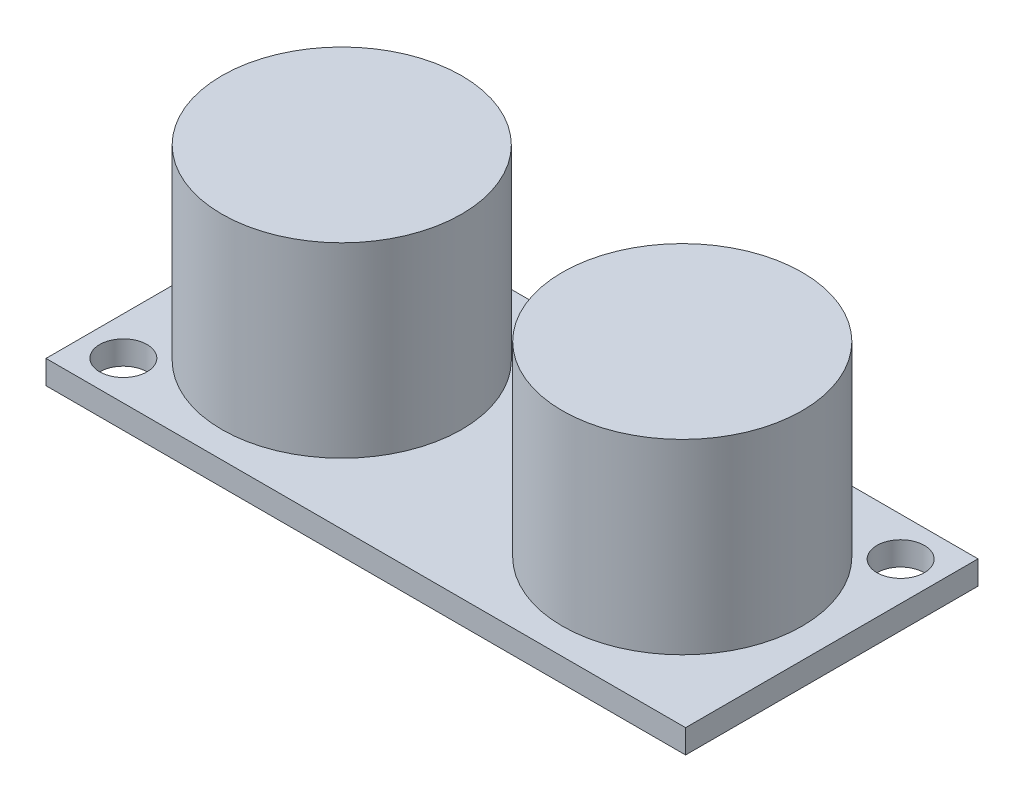
ISO-10303-21;
HEADER;
FILE_DESCRIPTION(('STEP AP214'),'2;1');
FILE_NAME('part.step','',(''),(''),'','','');
FILE_SCHEMA(('AUTOMOTIVE_DESIGN { 1 0 10303 214 1 1 1 1 }'));
ENDSEC;
DATA;
#1=APPLICATION_CONTEXT('core data for automotive mechanical design processes');
#2=APPLICATION_PROTOCOL_DEFINITION('international standard','automotive_design',2000,#1);
#3=PRODUCT_CONTEXT('',#1,'mechanical');
#4=PRODUCT('Part','Part','',(#3));
#5=PRODUCT_RELATED_PRODUCT_CATEGORY('part','',(#4));
#6=PRODUCT_DEFINITION_FORMATION('','',#4);
#7=PRODUCT_DEFINITION_CONTEXT('part definition',#1,'design');
#8=PRODUCT_DEFINITION('design','',#6,#7);
#9=PRODUCT_DEFINITION_SHAPE('','',#8);
#10=(LENGTH_UNIT() NAMED_UNIT(*) SI_UNIT(.MILLI.,.METRE.));
#11=(NAMED_UNIT(*) PLANE_ANGLE_UNIT() SI_UNIT($,.RADIAN.));
#12=(NAMED_UNIT(*) SI_UNIT($,.STERADIAN.) SOLID_ANGLE_UNIT());
#13=UNCERTAINTY_MEASURE_WITH_UNIT(LENGTH_MEASURE(1.E-05),#10,'distance_accuracy_value','');
#14=(GEOMETRIC_REPRESENTATION_CONTEXT(3) GLOBAL_UNCERTAINTY_ASSIGNED_CONTEXT((#13)) GLOBAL_UNIT_ASSIGNED_CONTEXT((#10,
#11,#12)) REPRESENTATION_CONTEXT('',''));
#15=CARTESIAN_POINT('',(0.,0.,0.));
#16=DIRECTION('',(0.,0.,1.));
#17=DIRECTION('',(1.,0.,0.));
#18=AXIS2_PLACEMENT_3D('',#15,#16,#17);
#19=CARTESIAN_POINT('',(0.,14.2,0.));
#20=DIRECTION('',(0.,1.,0.));
#21=DIRECTION('',(0.,0.,1.));
#22=AXIS2_PLACEMENT_3D('',#19,#20,#21);
#23=PLANE('',#22);
#24=CARTESIAN_POINT('',(-11.5,14.2,0.));
#25=DIRECTION('',(0.,1.,0.));
#26=DIRECTION('',(0.,0.,1.));
#27=AXIS2_PLACEMENT_3D('',#24,#25,#26);
#28=CIRCLE('',#27,8.1);
#29=CARTESIAN_POINT('',(-11.5,14.2,8.1));
#30=VERTEX_POINT('',#29);
#31=EDGE_CURVE('E19',#30,#30,#28,.F.);
#32=ORIENTED_EDGE('',*,*,#31,.F.);
#33=EDGE_LOOP('',(#32));
#34=FACE_BOUND('',#33,.T.);
#35=ADVANCED_FACE('F16',(#34),#23,.T.);
#36=CARTESIAN_POINT('',(0.,14.2,0.));
#37=DIRECTION('',(0.,1.,0.));
#38=DIRECTION('',(0.,0.,1.));
#39=AXIS2_PLACEMENT_3D('',#36,#37,#38);
#40=PLANE('',#39);
#41=CARTESIAN_POINT('',(11.5,14.2,0.));
#42=DIRECTION('',(0.,1.,0.));
#43=DIRECTION('',(0.,0.,1.));
#44=AXIS2_PLACEMENT_3D('',#41,#42,#43);
#45=CIRCLE('',#44,8.1);
#46=CARTESIAN_POINT('',(11.5,14.2,8.1));
#47=VERTEX_POINT('',#46);
#48=EDGE_CURVE('E152',#47,#47,#45,.F.);
#49=ORIENTED_EDGE('',*,*,#48,.F.);
#50=EDGE_LOOP('',(#49));
#51=FACE_BOUND('',#50,.T.);
#52=ADVANCED_FACE('F163',(#51),#40,.T.);
#53=CARTESIAN_POINT('',(-11.5,1.6,0.));
#54=DIRECTION('',(0.,1.,0.));
#55=DIRECTION('',(0.,0.,1.));
#56=AXIS2_PLACEMENT_3D('',#53,#54,#55);
#57=CYLINDRICAL_SURFACE('',#56,8.1);
#58=ORIENTED_EDGE('',*,*,#31,.T.);
#59=EDGE_LOOP('',(#58));
#60=FACE_BOUND('',#59,.T.);
#61=CARTESIAN_POINT('',(-11.5,1.6,0.));
#62=DIRECTION('',(0.,1.,0.));
#63=DIRECTION('',(0.,0.,1.));
#64=AXIS2_PLACEMENT_3D('',#61,#62,#63);
#65=CIRCLE('',#64,8.1);
#66=CARTESIAN_POINT('',(-11.5,1.6,8.1));
#67=VERTEX_POINT('',#66);
#68=EDGE_CURVE('E150',#67,#67,#65,.F.);
#69=ORIENTED_EDGE('',*,*,#68,.F.);
#70=EDGE_LOOP('',(#69));
#71=FACE_BOUND('',#70,.T.);
#72=ADVANCED_FACE('F159',(#60,#71),#57,.T.);
#73=CARTESIAN_POINT('',(11.5,1.6,0.));
#74=DIRECTION('',(0.,1.,0.));
#75=DIRECTION('',(0.,0.,1.));
#76=AXIS2_PLACEMENT_3D('',#73,#74,#75);
#77=CYLINDRICAL_SURFACE('',#76,8.1);
#78=ORIENTED_EDGE('',*,*,#48,.T.);
#79=EDGE_LOOP('',(#78));
#80=FACE_BOUND('',#79,.T.);
#81=CARTESIAN_POINT('',(11.5,1.6,0.));
#82=DIRECTION('',(0.,1.,0.));
#83=DIRECTION('',(0.,0.,1.));
#84=AXIS2_PLACEMENT_3D('',#81,#82,#83);
#85=CIRCLE('',#84,8.1);
#86=CARTESIAN_POINT('',(11.5,1.6,8.1));
#87=VERTEX_POINT('',#86);
#88=EDGE_CURVE('E147',#87,#87,#85,.F.);
#89=ORIENTED_EDGE('',*,*,#88,.F.);
#90=EDGE_LOOP('',(#89));
#91=FACE_BOUND('',#90,.T.);
#92=ADVANCED_FACE('F239',(#80,#91),#77,.T.);
#93=CARTESIAN_POINT('',(0.,-2.1,0.));
#94=DIRECTION('',(0.,-1.,0.));
#95=DIRECTION('',(0.,0.,-1.));
#96=AXIS2_PLACEMENT_3D('',#93,#94,#95);
#97=PLANE('',#96);
#98=DIRECTION('',(-1.,0.,0.));
#99=VECTOR('',#98,1.);
#100=CARTESIAN_POINT('',(-2.907056089516,-2.1,-2.35129536652));
#101=LINE('',#100,#99);
#102=CARTESIAN_POINT('',(3.078059388899,-2.1,-2.35129536652));
#103=VERTEX_POINT('',#102);
#104=CARTESIAN_POINT('',(-2.907056089516,-2.1,-2.35129536652));
#105=VERTEX_POINT('',#104);
#106=EDGE_CURVE('E399',#103,#105,#101,.T.);
#107=ORIENTED_EDGE('',*,*,#106,.F.);
#108=DIRECTION('',(0.,0.,-1.));
#109=VECTOR('',#108,1.);
#110=CARTESIAN_POINT('',(3.078059388899,-2.1,-2.35129536652));
#111=LINE('',#110,#109);
#112=CARTESIAN_POINT('',(3.078059388899,-2.1,1.752783818679));
#113=VERTEX_POINT('',#112);
#114=EDGE_CURVE('E84',#113,#103,#111,.T.);
#115=ORIENTED_EDGE('',*,*,#114,.F.);
#116=DIRECTION('',(1.,0.,0.));
#117=VECTOR('',#116,1.);
#118=CARTESIAN_POINT('',(3.078059388899,-2.1,1.752783818679));
#119=LINE('',#118,#117);
#120=CARTESIAN_POINT('',(-2.907056089516,-2.1,1.752783818679));
#121=VERTEX_POINT('',#120);
#122=EDGE_CURVE('E81',#121,#113,#119,.T.);
#123=ORIENTED_EDGE('',*,*,#122,.F.);
#124=DIRECTION('',(0.,0.,1.));
#125=VECTOR('',#124,1.);
#126=CARTESIAN_POINT('',(-2.907056089516,-2.1,1.752783818679));
#127=LINE('',#126,#125);
#128=EDGE_CURVE('E78',#105,#121,#127,.T.);
#129=ORIENTED_EDGE('',*,*,#128,.F.);
#130=EDGE_LOOP('',(#107,#115,#123,#129));
#131=FACE_BOUND('',#130,.T.);
#132=ADVANCED_FACE('F82',(#131),#97,.T.);
#133=CARTESIAN_POINT('',(0.,1.6,0.));
#134=DIRECTION('',(0.,1.,0.));
#135=DIRECTION('',(0.,0.,1.));
#136=AXIS2_PLACEMENT_3D('',#133,#134,#135);
#137=PLANE('',#136);
#138=DIRECTION('',(1.,0.,0.));
#139=VECTOR('',#138,1.);
#140=CARTESIAN_POINT('',(-21.6,1.6,9.875));
#141=LINE('',#140,#139);
#142=CARTESIAN_POINT('',(21.6,1.6,9.875));
#143=VERTEX_POINT('',#142);
#144=CARTESIAN_POINT('',(-21.6,1.6,9.875));
#145=VERTEX_POINT('',#144);
#146=EDGE_CURVE('E374',#143,#145,#141,.F.);
#147=ORIENTED_EDGE('',*,*,#146,.F.);
#148=DIRECTION('',(0.,0.,-1.));
#149=VECTOR('',#148,1.);
#150=CARTESIAN_POINT('',(21.6,1.6,9.875));
#151=LINE('',#150,#149);
#152=CARTESIAN_POINT('',(21.6,1.6,-9.875));
#153=VERTEX_POINT('',#152);
#154=EDGE_CURVE('E126',#153,#143,#151,.F.);
#155=ORIENTED_EDGE('',*,*,#154,.F.);
#156=DIRECTION('',(-1.,0.,0.));
#157=VECTOR('',#156,1.);
#158=CARTESIAN_POINT('',(21.6,1.6,-9.875));
#159=LINE('',#158,#157);
#160=CARTESIAN_POINT('',(-21.6,1.6,-9.875));
#161=VERTEX_POINT('',#160);
#162=EDGE_CURVE('E392',#161,#153,#159,.F.);
#163=ORIENTED_EDGE('',*,*,#162,.F.);
#164=DIRECTION('',(0.,0.,1.));
#165=VECTOR('',#164,1.);
#166=CARTESIAN_POINT('',(-21.6,1.6,-9.875));
#167=LINE('',#166,#165);
#168=EDGE_CURVE('E376',#145,#161,#167,.F.);
#169=ORIENTED_EDGE('',*,*,#168,.F.);
#170=EDGE_LOOP('',(#147,#155,#163,#169));
#171=FACE_BOUND('',#170,.T.);
#172=ORIENTED_EDGE('',*,*,#88,.T.);
#173=EDGE_LOOP('',(#172));
#174=FACE_BOUND('',#173,.T.);
#175=ORIENTED_EDGE('',*,*,#68,.T.);
#176=EDGE_LOOP('',(#175));
#177=FACE_BOUND('',#176,.T.);
#178=CARTESIAN_POINT('',(0.,1.6,-8.625));
#179=DIRECTION('',(0.,1.,0.));
#180=DIRECTION('',(0.,0.,1.));
#181=AXIS2_PLACEMENT_3D('',#178,#179,#180);
#182=CIRCLE('',#181,0.5);
#183=CARTESIAN_POINT('',(0.,1.6,-8.125));
#184=VERTEX_POINT('',#183);
#185=EDGE_CURVE('E90',#184,#184,#182,.F.);
#186=ORIENTED_EDGE('',*,*,#185,.T.);
#187=EDGE_LOOP('',(#186));
#188=FACE_BOUND('',#187,.T.);
#189=CARTESIAN_POINT('',(2.5,1.6,-8.625));
#190=DIRECTION('',(0.,1.,0.));
#191=DIRECTION('',(0.,0.,1.));
#192=AXIS2_PLACEMENT_3D('',#189,#190,#191);
#193=CIRCLE('',#192,0.5);
#194=CARTESIAN_POINT('',(2.5,1.6,-8.125));
#195=VERTEX_POINT('',#194);
#196=EDGE_CURVE('E129',#195,#195,#193,.F.);
#197=ORIENTED_EDGE('',*,*,#196,.T.);
#198=EDGE_LOOP('',(#197));
#199=FACE_BOUND('',#198,.T.);
#200=CARTESIAN_POINT('',(-2.5,1.6,-8.625));
#201=DIRECTION('',(0.,1.,0.));
#202=DIRECTION('',(0.,0.,1.));
#203=AXIS2_PLACEMENT_3D('',#200,#201,#202);
#204=CIRCLE('',#203,0.5);
#205=CARTESIAN_POINT('',(-2.5,1.6,-8.125));
#206=VERTEX_POINT('',#205);
#207=EDGE_CURVE('E132',#206,#206,#204,.F.);
#208=ORIENTED_EDGE('',*,*,#207,.T.);
#209=EDGE_LOOP('',(#208));
#210=FACE_BOUND('',#209,.T.);
#211=CARTESIAN_POINT('',(5.,1.6,-8.625));
#212=DIRECTION('',(0.,1.,0.));
#213=DIRECTION('',(0.,0.,1.));
#214=AXIS2_PLACEMENT_3D('',#211,#212,#213);
#215=CIRCLE('',#214,0.5);
#216=CARTESIAN_POINT('',(5.,1.6,-8.125));
#217=VERTEX_POINT('',#216);
#218=EDGE_CURVE('E135',#217,#217,#215,.F.);
#219=ORIENTED_EDGE('',*,*,#218,.T.);
#220=EDGE_LOOP('',(#219));
#221=FACE_BOUND('',#220,.T.);
#222=CARTESIAN_POINT('',(-5.,1.6,-8.625));
#223=DIRECTION('',(0.,1.,0.));
#224=DIRECTION('',(0.,0.,1.));
#225=AXIS2_PLACEMENT_3D('',#222,#223,#224);
#226=CIRCLE('',#225,0.5);
#227=CARTESIAN_POINT('',(-5.,1.6,-8.125));
#228=VERTEX_POINT('',#227);
#229=EDGE_CURVE('E138',#228,#228,#226,.F.);
#230=ORIENTED_EDGE('',*,*,#229,.T.);
#231=EDGE_LOOP('',(#230));
#232=FACE_BOUND('',#231,.T.);
#233=CARTESIAN_POINT('',(19.,1.6,-7.25));
#234=DIRECTION('',(0.,1.,0.));
#235=DIRECTION('',(0.,0.,1.));
#236=AXIS2_PLACEMENT_3D('',#233,#234,#235);
#237=CIRCLE('',#236,1.6);
#238=CARTESIAN_POINT('',(19.,1.6,-5.65));
#239=VERTEX_POINT('',#238);
#240=EDGE_CURVE('E141',#239,#239,#237,.F.);
#241=ORIENTED_EDGE('',*,*,#240,.T.);
#242=EDGE_LOOP('',(#241));
#243=FACE_BOUND('',#242,.T.);
#244=CARTESIAN_POINT('',(-19.,1.6,7.25));
#245=DIRECTION('',(0.,1.,0.));
#246=DIRECTION('',(0.,0.,1.));
#247=AXIS2_PLACEMENT_3D('',#244,#245,#246);
#248=CIRCLE('',#247,1.6);
#249=CARTESIAN_POINT('',(-19.,1.6,8.85));
#250=VERTEX_POINT('',#249);
#251=EDGE_CURVE('E144',#250,#250,#248,.F.);
#252=ORIENTED_EDGE('',*,*,#251,.T.);
#253=EDGE_LOOP('',(#252));
#254=FACE_BOUND('',#253,.T.);
#255=ADVANCED_FACE('F232',(#171,#174,#177,#188,#199,#210,#221,#232,#243,#254),#137,.T.);
#256=CARTESIAN_POINT('',(-19.,1.6,7.25));
#257=DIRECTION('',(0.,1.,0.));
#258=DIRECTION('',(0.,0.,1.));
#259=AXIS2_PLACEMENT_3D('',#256,#257,#258);
#260=CYLINDRICAL_SURFACE('',#259,1.6);
#261=ORIENTED_EDGE('',*,*,#251,.F.);
#262=EDGE_LOOP('',(#261));
#263=FACE_BOUND('',#262,.T.);
#264=CARTESIAN_POINT('',(-19.,0.,7.25));
#265=DIRECTION('',(0.,1.,0.));
#266=DIRECTION('',(0.,0.,1.));
#267=AXIS2_PLACEMENT_3D('',#264,#265,#266);
#268=CIRCLE('',#267,1.6);
#269=CARTESIAN_POINT('',(-19.,0.,8.85));
#270=VERTEX_POINT('',#269);
#271=EDGE_CURVE('E123',#270,#270,#268,.F.);
#272=ORIENTED_EDGE('',*,*,#271,.T.);
#273=EDGE_LOOP('',(#272));
#274=FACE_BOUND('',#273,.T.);
#275=ADVANCED_FACE('F228',(#263,#274),#260,.F.);
#276=CARTESIAN_POINT('',(19.,1.6,-7.25));
#277=DIRECTION('',(0.,1.,0.));
#278=DIRECTION('',(0.,0.,1.));
#279=AXIS2_PLACEMENT_3D('',#276,#277,#278);
#280=CYLINDRICAL_SURFACE('',#279,1.6);
#281=ORIENTED_EDGE('',*,*,#240,.F.);
#282=EDGE_LOOP('',(#281));
#283=FACE_BOUND('',#282,.T.);
#284=CARTESIAN_POINT('',(19.,0.,-7.25));
#285=DIRECTION('',(0.,1.,0.));
#286=DIRECTION('',(0.,0.,1.));
#287=AXIS2_PLACEMENT_3D('',#284,#285,#286);
#288=CIRCLE('',#287,1.6);
#289=CARTESIAN_POINT('',(19.,0.,-5.65));
#290=VERTEX_POINT('',#289);
#291=EDGE_CURVE('E120',#290,#290,#288,.F.);
#292=ORIENTED_EDGE('',*,*,#291,.T.);
#293=EDGE_LOOP('',(#292));
#294=FACE_BOUND('',#293,.T.);
#295=ADVANCED_FACE('F224',(#283,#294),#280,.F.);
#296=CARTESIAN_POINT('',(-5.,1.6,-8.625));
#297=DIRECTION('',(0.,1.,0.));
#298=DIRECTION('',(0.,0.,1.));
#299=AXIS2_PLACEMENT_3D('',#296,#297,#298);
#300=CYLINDRICAL_SURFACE('',#299,0.5);
#301=ORIENTED_EDGE('',*,*,#229,.F.);
#302=EDGE_LOOP('',(#301));
#303=FACE_BOUND('',#302,.T.);
#304=CARTESIAN_POINT('',(-5.,0.,-8.625));
#305=DIRECTION('',(0.,1.,0.));
#306=DIRECTION('',(0.,0.,1.));
#307=AXIS2_PLACEMENT_3D('',#304,#305,#306);
#308=CIRCLE('',#307,0.5);
#309=CARTESIAN_POINT('',(-5.,0.,-8.125));
#310=VERTEX_POINT('',#309);
#311=EDGE_CURVE('E117',#310,#310,#308,.F.);
#312=ORIENTED_EDGE('',*,*,#311,.T.);
#313=EDGE_LOOP('',(#312));
#314=FACE_BOUND('',#313,.T.);
#315=ADVANCED_FACE('F220',(#303,#314),#300,.F.);
#316=CARTESIAN_POINT('',(5.,1.6,-8.625));
#317=DIRECTION('',(0.,1.,0.));
#318=DIRECTION('',(0.,0.,1.));
#319=AXIS2_PLACEMENT_3D('',#316,#317,#318);
#320=CYLINDRICAL_SURFACE('',#319,0.5);
#321=ORIENTED_EDGE('',*,*,#218,.F.);
#322=EDGE_LOOP('',(#321));
#323=FACE_BOUND('',#322,.T.);
#324=CARTESIAN_POINT('',(5.,0.,-8.625));
#325=DIRECTION('',(0.,1.,0.));
#326=DIRECTION('',(0.,0.,1.));
#327=AXIS2_PLACEMENT_3D('',#324,#325,#326);
#328=CIRCLE('',#327,0.5);
#329=CARTESIAN_POINT('',(5.,0.,-8.125));
#330=VERTEX_POINT('',#329);
#331=EDGE_CURVE('E114',#330,#330,#328,.F.);
#332=ORIENTED_EDGE('',*,*,#331,.T.);
#333=EDGE_LOOP('',(#332));
#334=FACE_BOUND('',#333,.T.);
#335=ADVANCED_FACE('F216',(#323,#334),#320,.F.);
#336=CARTESIAN_POINT('',(-2.5,1.6,-8.625));
#337=DIRECTION('',(0.,1.,0.));
#338=DIRECTION('',(0.,0.,1.));
#339=AXIS2_PLACEMENT_3D('',#336,#337,#338);
#340=CYLINDRICAL_SURFACE('',#339,0.5);
#341=ORIENTED_EDGE('',*,*,#207,.F.);
#342=EDGE_LOOP('',(#341));
#343=FACE_BOUND('',#342,.T.);
#344=CARTESIAN_POINT('',(-2.5,0.,-8.625));
#345=DIRECTION('',(0.,1.,0.));
#346=DIRECTION('',(0.,0.,1.));
#347=AXIS2_PLACEMENT_3D('',#344,#345,#346);
#348=CIRCLE('',#347,0.5);
#349=CARTESIAN_POINT('',(-2.5,0.,-8.125));
#350=VERTEX_POINT('',#349);
#351=EDGE_CURVE('E111',#350,#350,#348,.F.);
#352=ORIENTED_EDGE('',*,*,#351,.T.);
#353=EDGE_LOOP('',(#352));
#354=FACE_BOUND('',#353,.T.);
#355=ADVANCED_FACE('F212',(#343,#354),#340,.F.);
#356=CARTESIAN_POINT('',(2.5,1.6,-8.625));
#357=DIRECTION('',(0.,1.,0.));
#358=DIRECTION('',(0.,0.,1.));
#359=AXIS2_PLACEMENT_3D('',#356,#357,#358);
#360=CYLINDRICAL_SURFACE('',#359,0.5);
#361=ORIENTED_EDGE('',*,*,#196,.F.);
#362=EDGE_LOOP('',(#361));
#363=FACE_BOUND('',#362,.T.);
#364=CARTESIAN_POINT('',(2.5,0.,-8.625));
#365=DIRECTION('',(0.,1.,0.));
#366=DIRECTION('',(0.,0.,1.));
#367=AXIS2_PLACEMENT_3D('',#364,#365,#366);
#368=CIRCLE('',#367,0.5);
#369=CARTESIAN_POINT('',(2.5,0.,-8.125));
#370=VERTEX_POINT('',#369);
#371=EDGE_CURVE('E108',#370,#370,#368,.F.);
#372=ORIENTED_EDGE('',*,*,#371,.T.);
#373=EDGE_LOOP('',(#372));
#374=FACE_BOUND('',#373,.T.);
#375=ADVANCED_FACE('F208',(#363,#374),#360,.F.);
#376=CARTESIAN_POINT('',(0.,1.6,-8.625));
#377=DIRECTION('',(0.,1.,0.));
#378=DIRECTION('',(0.,0.,1.));
#379=AXIS2_PLACEMENT_3D('',#376,#377,#378);
#380=CYLINDRICAL_SURFACE('',#379,0.5);
#381=ORIENTED_EDGE('',*,*,#185,.F.);
#382=EDGE_LOOP('',(#381));
#383=FACE_BOUND('',#382,.T.);
#384=CARTESIAN_POINT('',(0.,0.,-8.625));
#385=DIRECTION('',(0.,1.,0.));
#386=DIRECTION('',(0.,0.,1.));
#387=AXIS2_PLACEMENT_3D('',#384,#385,#386);
#388=CIRCLE('',#387,0.5);
#389=CARTESIAN_POINT('',(0.,0.,-8.125));
#390=VERTEX_POINT('',#389);
#391=EDGE_CURVE('E105',#390,#390,#388,.F.);
#392=ORIENTED_EDGE('',*,*,#391,.T.);
#393=EDGE_LOOP('',(#392));
#394=FACE_BOUND('',#393,.T.);
#395=ADVANCED_FACE('F205',(#383,#394),#380,.F.);
#396=CARTESIAN_POINT('',(3.078059388899,0.,1.752783818679));
#397=DIRECTION('',(0.,0.,1.));
#398=DIRECTION('',(1.,0.,0.));
#399=AXIS2_PLACEMENT_3D('',#396,#397,#398);
#400=PLANE('',#399);
#401=DIRECTION('',(0.,1.,0.));
#402=VECTOR('',#401,1.);
#403=CARTESIAN_POINT('',(-2.907056089516,0.,1.752783818679));
#404=LINE('',#403,#402);
#405=CARTESIAN_POINT('',(-2.907056089516,0.,1.752783818679));
#406=VERTEX_POINT('',#405);
#407=EDGE_CURVE('E89',#121,#406,#404,.T.);
#408=ORIENTED_EDGE('',*,*,#407,.F.);
#409=ORIENTED_EDGE('',*,*,#122,.T.);
#410=DIRECTION('',(0.,1.,0.));
#411=VECTOR('',#410,1.);
#412=CARTESIAN_POINT('',(3.078059388899,0.,1.752783818679));
#413=LINE('',#412,#411);
#414=CARTESIAN_POINT('',(3.078059388899,0.,1.752783818679));
#415=VERTEX_POINT('',#414);
#416=EDGE_CURVE('E395',#415,#113,#413,.F.);
#417=ORIENTED_EDGE('',*,*,#416,.F.);
#418=DIRECTION('',(1.,0.,0.));
#419=VECTOR('',#418,1.);
#420=CARTESIAN_POINT('',(0.,0.,1.752783818679));
#421=LINE('',#420,#419);
#422=EDGE_CURVE('E101',#415,#406,#421,.F.);
#423=ORIENTED_EDGE('',*,*,#422,.T.);
#424=EDGE_LOOP('',(#408,#409,#417,#423));
#425=FACE_BOUND('',#424,.T.);
#426=ADVANCED_FACE('F100',(#425),#400,.T.);
#427=CARTESIAN_POINT('',(-2.907056089516,0.,1.752783818679));
#428=DIRECTION('',(-1.,0.,0.));
#429=DIRECTION('',(0.,0.,1.));
#430=AXIS2_PLACEMENT_3D('',#427,#428,#429);
#431=PLANE('',#430);
#432=DIRECTION('',(0.,1.,0.));
#433=VECTOR('',#432,1.);
#434=CARTESIAN_POINT('',(-2.907056089516,0.,-2.35129536652));
#435=LINE('',#434,#433);
#436=CARTESIAN_POINT('',(-2.907056089516,0.,-2.35129536652));
#437=VERTEX_POINT('',#436);
#438=EDGE_CURVE('E97',#105,#437,#435,.T.);
#439=ORIENTED_EDGE('',*,*,#438,.F.);
#440=ORIENTED_EDGE('',*,*,#128,.T.);
#441=ORIENTED_EDGE('',*,*,#407,.T.);
#442=DIRECTION('',(0.,0.,1.));
#443=VECTOR('',#442,1.);
#444=CARTESIAN_POINT('',(-2.907056089516,0.,0.));
#445=LINE('',#444,#443);
#446=EDGE_CURVE('E405',#406,#437,#445,.F.);
#447=ORIENTED_EDGE('',*,*,#446,.T.);
#448=EDGE_LOOP('',(#439,#440,#441,#447));
#449=FACE_BOUND('',#448,.T.);
#450=ADVANCED_FACE('F94',(#449),#431,.T.);
#451=CARTESIAN_POINT('',(-2.907056089516,0.,-2.35129536652));
#452=DIRECTION('',(0.,0.,-1.));
#453=DIRECTION('',(-1.,0.,0.));
#454=AXIS2_PLACEMENT_3D('',#451,#452,#453);
#455=PLANE('',#454);
#456=DIRECTION('',(0.,1.,0.));
#457=VECTOR('',#456,1.);
#458=CARTESIAN_POINT('',(3.078059388899,0.,-2.35129536652));
#459=LINE('',#458,#457);
#460=CARTESIAN_POINT('',(3.078059388899,0.,-2.35129536652));
#461=VERTEX_POINT('',#460);
#462=EDGE_CURVE('E397',#103,#461,#459,.T.);
#463=ORIENTED_EDGE('',*,*,#462,.F.);
#464=ORIENTED_EDGE('',*,*,#106,.T.);
#465=ORIENTED_EDGE('',*,*,#438,.T.);
#466=DIRECTION('',(1.,0.,0.));
#467=VECTOR('',#466,1.);
#468=CARTESIAN_POINT('',(0.,0.,-2.35129536652));
#469=LINE('',#468,#467);
#470=EDGE_CURVE('E403',#437,#461,#469,.T.);
#471=ORIENTED_EDGE('',*,*,#470,.T.);
#472=EDGE_LOOP('',(#463,#464,#465,#471));
#473=FACE_BOUND('',#472,.T.);
#474=ADVANCED_FACE('F196',(#473),#455,.T.);
#475=CARTESIAN_POINT('',(3.078059388899,0.,-2.35129536652));
#476=DIRECTION('',(1.,0.,0.));
#477=DIRECTION('',(0.,0.,-1.));
#478=AXIS2_PLACEMENT_3D('',#475,#476,#477);
#479=PLANE('',#478);
#480=ORIENTED_EDGE('',*,*,#416,.T.);
#481=ORIENTED_EDGE('',*,*,#114,.T.);
#482=ORIENTED_EDGE('',*,*,#462,.T.);
#483=DIRECTION('',(0.,0.,1.));
#484=VECTOR('',#483,1.);
#485=CARTESIAN_POINT('',(3.078059388899,0.,0.));
#486=LINE('',#485,#484);
#487=EDGE_CURVE('E407',#461,#415,#486,.T.);
#488=ORIENTED_EDGE('',*,*,#487,.T.);
#489=EDGE_LOOP('',(#480,#481,#482,#488));
#490=FACE_BOUND('',#489,.T.);
#491=ADVANCED_FACE('F192',(#490),#479,.T.);
#492=CARTESIAN_POINT('',(21.6,0.,-9.875));
#493=DIRECTION('',(0.,0.,-1.));
#494=DIRECTION('',(-1.,0.,0.));
#495=AXIS2_PLACEMENT_3D('',#492,#493,#494);
#496=PLANE('',#495);
#497=DIRECTION('',(0.,1.,0.));
#498=VECTOR('',#497,1.);
#499=CARTESIAN_POINT('',(-21.6,0.,-9.875));
#500=LINE('',#499,#498);
#501=CARTESIAN_POINT('',(-21.6,0.,-9.875));
#502=VERTEX_POINT('',#501);
#503=EDGE_CURVE('E390',#161,#502,#500,.F.);
#504=ORIENTED_EDGE('',*,*,#503,.F.);
#505=ORIENTED_EDGE('',*,*,#162,.T.);
#506=DIRECTION('',(0.,1.,0.));
#507=VECTOR('',#506,1.);
#508=CARTESIAN_POINT('',(21.6,0.,-9.875));
#509=LINE('',#508,#507);
#510=CARTESIAN_POINT('',(21.6,0.,-9.875));
#511=VERTEX_POINT('',#510);
#512=EDGE_CURVE('E382',#511,#153,#509,.T.);
#513=ORIENTED_EDGE('',*,*,#512,.F.);
#514=DIRECTION('',(1.,0.,0.));
#515=VECTOR('',#514,1.);
#516=CARTESIAN_POINT('',(0.,0.,-9.875));
#517=LINE('',#516,#515);
#518=EDGE_CURVE('E413',#511,#502,#517,.F.);
#519=ORIENTED_EDGE('',*,*,#518,.T.);
#520=EDGE_LOOP('',(#504,#505,#513,#519));
#521=FACE_BOUND('',#520,.T.);
#522=ADVANCED_FACE('F188',(#521),#496,.T.);
#523=CARTESIAN_POINT('',(-21.6,0.,-9.875));
#524=DIRECTION('',(-1.,0.,0.));
#525=DIRECTION('',(0.,0.,1.));
#526=AXIS2_PLACEMENT_3D('',#523,#524,#525);
#527=PLANE('',#526);
#528=DIRECTION('',(0.,1.,0.));
#529=VECTOR('',#528,1.);
#530=CARTESIAN_POINT('',(-21.6,0.,9.875));
#531=LINE('',#530,#529);
#532=CARTESIAN_POINT('',(-21.6,0.,9.875));
#533=VERTEX_POINT('',#532);
#534=EDGE_CURVE('E378',#145,#533,#531,.F.);
#535=ORIENTED_EDGE('',*,*,#534,.F.);
#536=ORIENTED_EDGE('',*,*,#168,.T.);
#537=ORIENTED_EDGE('',*,*,#503,.T.);
#538=DIRECTION('',(0.,0.,1.));
#539=VECTOR('',#538,1.);
#540=CARTESIAN_POINT('',(-21.6,0.,0.));
#541=LINE('',#540,#539);
#542=EDGE_CURVE('E416',#502,#533,#541,.T.);
#543=ORIENTED_EDGE('',*,*,#542,.T.);
#544=EDGE_LOOP('',(#535,#536,#537,#543));
#545=FACE_BOUND('',#544,.T.);
#546=ADVANCED_FACE('F184',(#545),#527,.T.);
#547=CARTESIAN_POINT('',(-21.6,0.,9.875));
#548=DIRECTION('',(0.,0.,1.));
#549=DIRECTION('',(1.,0.,0.));
#550=AXIS2_PLACEMENT_3D('',#547,#548,#549);
#551=PLANE('',#550);
#552=DIRECTION('',(0.,1.,0.));
#553=VECTOR('',#552,1.);
#554=CARTESIAN_POINT('',(21.6,0.,9.875));
#555=LINE('',#554,#553);
#556=CARTESIAN_POINT('',(21.6,0.,9.875));
#557=VERTEX_POINT('',#556);
#558=EDGE_CURVE('E33',#143,#557,#555,.F.);
#559=ORIENTED_EDGE('',*,*,#558,.F.);
#560=ORIENTED_EDGE('',*,*,#146,.T.);
#561=ORIENTED_EDGE('',*,*,#534,.T.);
#562=DIRECTION('',(1.,0.,0.));
#563=VECTOR('',#562,1.);
#564=CARTESIAN_POINT('',(0.,0.,9.875));
#565=LINE('',#564,#563);
#566=EDGE_CURVE('E25',#533,#557,#565,.T.);
#567=ORIENTED_EDGE('',*,*,#566,.T.);
#568=EDGE_LOOP('',(#559,#560,#561,#567));
#569=FACE_BOUND('',#568,.T.);
#570=ADVANCED_FACE('F177',(#569),#551,.T.);
#571=CARTESIAN_POINT('',(21.6,0.,9.875));
#572=DIRECTION('',(1.,0.,0.));
#573=DIRECTION('',(0.,0.,-1.));
#574=AXIS2_PLACEMENT_3D('',#571,#572,#573);
#575=PLANE('',#574);
#576=ORIENTED_EDGE('',*,*,#512,.T.);
#577=ORIENTED_EDGE('',*,*,#154,.T.);
#578=ORIENTED_EDGE('',*,*,#558,.T.);
#579=DIRECTION('',(0.,0.,1.));
#580=VECTOR('',#579,1.);
#581=CARTESIAN_POINT('',(21.6,0.,0.));
#582=LINE('',#581,#580);
#583=EDGE_CURVE('E10',#557,#511,#582,.F.);
#584=ORIENTED_EDGE('',*,*,#583,.T.);
#585=EDGE_LOOP('',(#576,#577,#578,#584));
#586=FACE_BOUND('',#585,.T.);
#587=ADVANCED_FACE('F171',(#586),#575,.T.);
#588=CARTESIAN_POINT('',(0.,0.,0.));
#589=DIRECTION('',(0.,1.,0.));
#590=DIRECTION('',(0.,0.,1.));
#591=AXIS2_PLACEMENT_3D('',#588,#589,#590);
#592=PLANE('',#591);
#593=ORIENTED_EDGE('',*,*,#566,.F.);
#594=ORIENTED_EDGE('',*,*,#542,.F.);
#595=ORIENTED_EDGE('',*,*,#518,.F.);
#596=ORIENTED_EDGE('',*,*,#583,.F.);
#597=EDGE_LOOP('',(#593,#594,#595,#596));
#598=FACE_BOUND('',#597,.T.);
#599=ORIENTED_EDGE('',*,*,#470,.F.);
#600=ORIENTED_EDGE('',*,*,#446,.F.);
#601=ORIENTED_EDGE('',*,*,#422,.F.);
#602=ORIENTED_EDGE('',*,*,#487,.F.);
#603=EDGE_LOOP('',(#599,#600,#601,#602));
#604=FACE_BOUND('',#603,.T.);
#605=ORIENTED_EDGE('',*,*,#391,.F.);
#606=EDGE_LOOP('',(#605));
#607=FACE_BOUND('',#606,.T.);
#608=ORIENTED_EDGE('',*,*,#371,.F.);
#609=EDGE_LOOP('',(#608));
#610=FACE_BOUND('',#609,.T.);
#611=ORIENTED_EDGE('',*,*,#351,.F.);
#612=EDGE_LOOP('',(#611));
#613=FACE_BOUND('',#612,.T.);
#614=ORIENTED_EDGE('',*,*,#331,.F.);
#615=EDGE_LOOP('',(#614));
#616=FACE_BOUND('',#615,.T.);
#617=ORIENTED_EDGE('',*,*,#311,.F.);
#618=EDGE_LOOP('',(#617));
#619=FACE_BOUND('',#618,.T.);
#620=ORIENTED_EDGE('',*,*,#291,.F.);
#621=EDGE_LOOP('',(#620));
#622=FACE_BOUND('',#621,.T.);
#623=ORIENTED_EDGE('',*,*,#271,.F.);
#624=EDGE_LOOP('',(#623));
#625=FACE_BOUND('',#624,.T.);
#626=ADVANCED_FACE('F169',(#598,#604,#607,#610,#613,#616,#619,#622,#625),#592,.F.);
#627=CLOSED_SHELL('',(#35,#52,#72,#92,#132,#255,#275,#295,#315,#335,#355,#375,#395,#426,#450,
#474,#491,#522,#546,#570,#587,#626));
#628=MANIFOLD_SOLID_BREP('B1',#627);
#629=ADVANCED_BREP_SHAPE_REPRESENTATION('',(#18,#628),#14);
#630=SHAPE_DEFINITION_REPRESENTATION(#9,#629);
ENDSEC;
END-ISO-10303-21;
